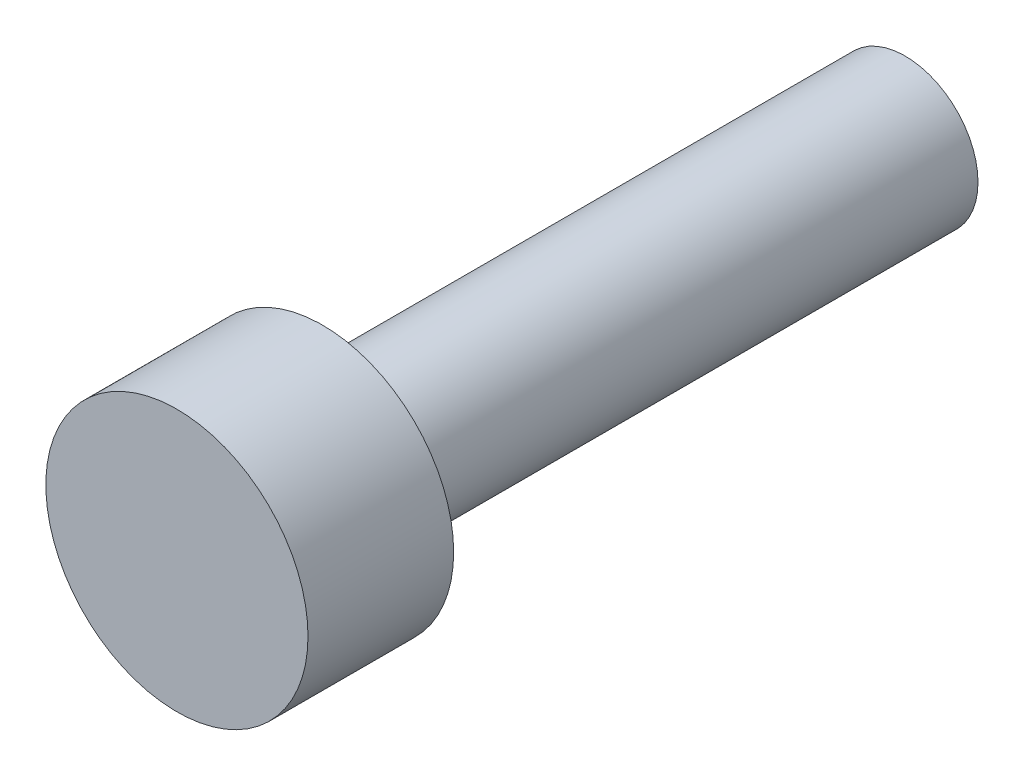
ISO-10303-21;
HEADER;
FILE_DESCRIPTION(('STEP AP214'),'2;1');
FILE_NAME('part.step','',(''),(''),'','','');
FILE_SCHEMA(('AUTOMOTIVE_DESIGN { 1 0 10303 214 1 1 1 1 }'));
ENDSEC;
DATA;
#1=APPLICATION_CONTEXT('core data for automotive mechanical design processes');
#2=APPLICATION_PROTOCOL_DEFINITION('international standard','automotive_design',2000,#1);
#3=PRODUCT_CONTEXT('',#1,'mechanical');
#4=PRODUCT('Part','Part','',(#3));
#5=PRODUCT_RELATED_PRODUCT_CATEGORY('part','',(#4));
#6=PRODUCT_DEFINITION_FORMATION('','',#4);
#7=PRODUCT_DEFINITION_CONTEXT('part definition',#1,'design');
#8=PRODUCT_DEFINITION('design','',#6,#7);
#9=PRODUCT_DEFINITION_SHAPE('','',#8);
#10=(LENGTH_UNIT() NAMED_UNIT(*) SI_UNIT(.MILLI.,.METRE.));
#11=(NAMED_UNIT(*) PLANE_ANGLE_UNIT() SI_UNIT($,.RADIAN.));
#12=(NAMED_UNIT(*) SI_UNIT($,.STERADIAN.) SOLID_ANGLE_UNIT());
#13=UNCERTAINTY_MEASURE_WITH_UNIT(LENGTH_MEASURE(1.E-05),#10,'distance_accuracy_value','');
#14=(GEOMETRIC_REPRESENTATION_CONTEXT(3) GLOBAL_UNCERTAINTY_ASSIGNED_CONTEXT((#13)) GLOBAL_UNIT_ASSIGNED_CONTEXT((#10,
#11,#12)) REPRESENTATION_CONTEXT('',''));
#15=CARTESIAN_POINT('',(0.,0.,0.));
#16=DIRECTION('',(0.,0.,1.));
#17=DIRECTION('',(1.,0.,0.));
#18=AXIS2_PLACEMENT_3D('',#15,#16,#17);
#19=CARTESIAN_POINT('',(0.,0.,2.5));
#20=DIRECTION('',(0.,0.,-1.));
#21=DIRECTION('',(-1.,0.,0.));
#22=AXIS2_PLACEMENT_3D('',#19,#20,#21);
#23=CYLINDRICAL_SURFACE('',#22,2.25);
#24=CARTESIAN_POINT('',(0.,0.,2.5));
#25=DIRECTION('',(0.,0.,1.));
#26=DIRECTION('',(1.,0.,0.));
#27=AXIS2_PLACEMENT_3D('',#24,#25,#26);
#28=CIRCLE('',#27,2.25);
#29=CARTESIAN_POINT('',(2.25,0.,2.5));
#30=VERTEX_POINT('',#29);
#31=EDGE_CURVE('E10',#30,#30,#28,.T.);
#32=ORIENTED_EDGE('',*,*,#31,.F.);
#33=EDGE_LOOP('',(#32));
#34=FACE_BOUND('',#33,.T.);
#35=CARTESIAN_POINT('',(0.,0.,0.));
#36=DIRECTION('',(0.,0.,1.));
#37=DIRECTION('',(1.,0.,0.));
#38=AXIS2_PLACEMENT_3D('',#35,#36,#37);
#39=CIRCLE('',#38,2.25);
#40=CARTESIAN_POINT('',(2.25,0.,0.));
#41=VERTEX_POINT('',#40);
#42=EDGE_CURVE('E45',#41,#41,#39,.T.);
#43=ORIENTED_EDGE('',*,*,#42,.T.);
#44=EDGE_LOOP('',(#43));
#45=FACE_BOUND('',#44,.T.);
#46=ADVANCED_FACE('F39',(#34,#45),#23,.T.);
#47=CARTESIAN_POINT('',(0.,0.,2.5));
#48=DIRECTION('',(0.,0.,1.));
#49=DIRECTION('',(1.,0.,0.));
#50=AXIS2_PLACEMENT_3D('',#47,#48,#49);
#51=PLANE('',#50);
#52=ORIENTED_EDGE('',*,*,#31,.T.);
#53=EDGE_LOOP('',(#52));
#54=FACE_BOUND('',#53,.T.);
#55=ADVANCED_FACE('F77',(#54),#51,.T.);
#56=CARTESIAN_POINT('',(0.,0.,0.));
#57=DIRECTION('',(0.,0.,1.));
#58=DIRECTION('',(1.,0.,0.));
#59=AXIS2_PLACEMENT_3D('',#56,#57,#58);
#60=PLANE('',#59);
#61=CARTESIAN_POINT('',(0.,0.,0.));
#62=DIRECTION('',(0.,0.,1.));
#63=DIRECTION('',(1.,0.,0.));
#64=AXIS2_PLACEMENT_3D('',#61,#62,#63);
#65=CIRCLE('',#64,1.25);
#66=CARTESIAN_POINT('',(1.25,0.,0.));
#67=VERTEX_POINT('',#66);
#68=EDGE_CURVE('E55',#67,#67,#65,.T.);
#69=ORIENTED_EDGE('',*,*,#68,.T.);
#70=EDGE_LOOP('',(#69));
#71=FACE_BOUND('',#70,.T.);
#72=ORIENTED_EDGE('',*,*,#42,.F.);
#73=EDGE_LOOP('',(#72));
#74=FACE_BOUND('',#73,.T.);
#75=ADVANCED_FACE('F62',(#71,#74),#60,.F.);
#76=CARTESIAN_POINT('',(0.,0.,0.));
#77=DIRECTION('',(0.,0.,-1.));
#78=DIRECTION('',(-1.,0.,0.));
#79=AXIS2_PLACEMENT_3D('',#76,#77,#78);
#80=CYLINDRICAL_SURFACE('',#79,1.25);
#81=ORIENTED_EDGE('',*,*,#68,.F.);
#82=EDGE_LOOP('',(#81));
#83=FACE_BOUND('',#82,.T.);
#84=CARTESIAN_POINT('',(0.,0.,-10.));
#85=DIRECTION('',(0.,0.,1.));
#86=DIRECTION('',(1.,0.,0.));
#87=AXIS2_PLACEMENT_3D('',#84,#85,#86);
#88=CIRCLE('',#87,1.25);
#89=CARTESIAN_POINT('',(1.25,0.,-10.));
#90=VERTEX_POINT('',#89);
#91=EDGE_CURVE('E53',#90,#90,#88,.T.);
#92=ORIENTED_EDGE('',*,*,#91,.T.);
#93=EDGE_LOOP('',(#92));
#94=FACE_BOUND('',#93,.T.);
#95=ADVANCED_FACE('F68',(#83,#94),#80,.T.);
#96=CARTESIAN_POINT('',(0.,0.,-10.));
#97=DIRECTION('',(0.,0.,1.));
#98=DIRECTION('',(1.,0.,0.));
#99=AXIS2_PLACEMENT_3D('',#96,#97,#98);
#100=PLANE('',#99);
#101=ORIENTED_EDGE('',*,*,#91,.F.);
#102=EDGE_LOOP('',(#101));
#103=FACE_BOUND('',#102,.T.);
#104=ADVANCED_FACE('F67',(#103),#100,.F.);
#105=CLOSED_SHELL('',(#46,#55,#75,#95,#104));
#106=MANIFOLD_SOLID_BREP('B2',#105);
#107=ADVANCED_BREP_SHAPE_REPRESENTATION('',(#18,#106),#14);
#108=SHAPE_DEFINITION_REPRESENTATION(#9,#107);
ENDSEC;
END-ISO-10303-21;
